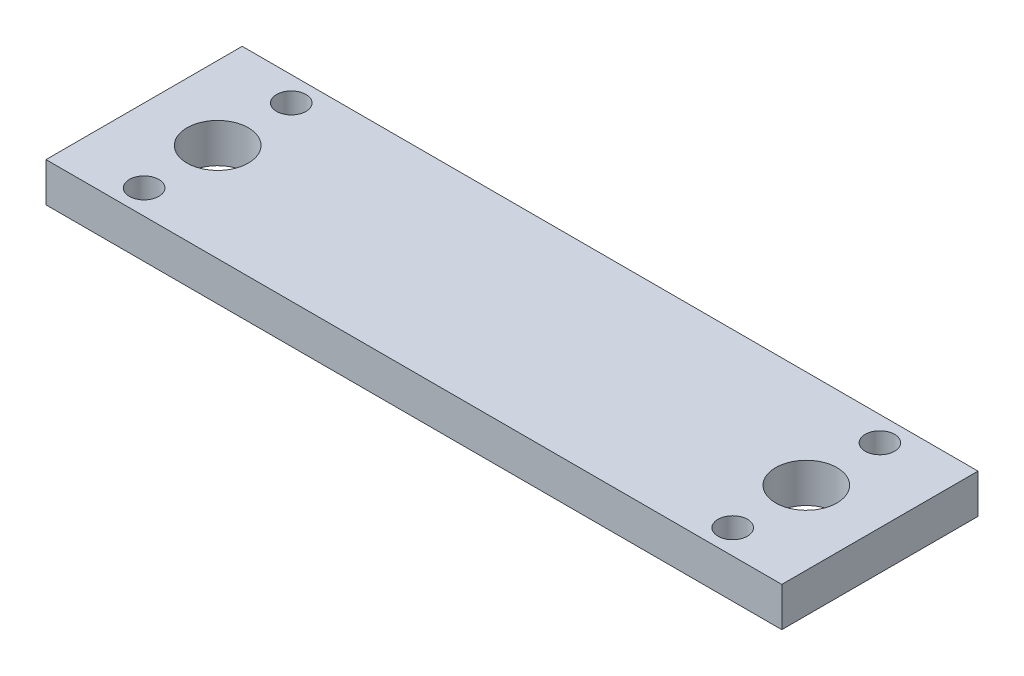
ISO-10303-21;
HEADER;
FILE_DESCRIPTION(('STEP AP214'),'2;1');
FILE_NAME('part.step','',(''),(''),'','','');
FILE_SCHEMA(('AUTOMOTIVE_DESIGN { 1 0 10303 214 1 1 1 1 }'));
ENDSEC;
DATA;
#1=APPLICATION_CONTEXT('core data for automotive mechanical design processes');
#2=APPLICATION_PROTOCOL_DEFINITION('international standard','automotive_design',2000,#1);
#3=PRODUCT_CONTEXT('',#1,'mechanical');
#4=PRODUCT('Part','Part','',(#3));
#5=PRODUCT_RELATED_PRODUCT_CATEGORY('part','',(#4));
#6=PRODUCT_DEFINITION_FORMATION('','',#4);
#7=PRODUCT_DEFINITION_CONTEXT('part definition',#1,'design');
#8=PRODUCT_DEFINITION('design','',#6,#7);
#9=PRODUCT_DEFINITION_SHAPE('','',#8);
#10=(LENGTH_UNIT() NAMED_UNIT(*) SI_UNIT(.MILLI.,.METRE.));
#11=(NAMED_UNIT(*) PLANE_ANGLE_UNIT() SI_UNIT($,.RADIAN.));
#12=(NAMED_UNIT(*) SI_UNIT($,.STERADIAN.) SOLID_ANGLE_UNIT());
#13=UNCERTAINTY_MEASURE_WITH_UNIT(LENGTH_MEASURE(1.E-05),#10,'distance_accuracy_value','');
#14=(GEOMETRIC_REPRESENTATION_CONTEXT(3) GLOBAL_UNCERTAINTY_ASSIGNED_CONTEXT((#13)) GLOBAL_UNIT_ASSIGNED_CONTEXT((#10,
#11,#12)) REPRESENTATION_CONTEXT('',''));
#15=CARTESIAN_POINT('',(0.,0.,0.));
#16=DIRECTION('',(0.,0.,1.));
#17=DIRECTION('',(1.,0.,0.));
#18=AXIS2_PLACEMENT_3D('',#15,#16,#17);
#19=CARTESIAN_POINT('',(0.,16.,0.));
#20=DIRECTION('',(0.,-1.,0.));
#21=DIRECTION('',(0.,0.,-1.));
#22=AXIS2_PLACEMENT_3D('',#19,#20,#21);
#23=PLANE('',#22);
#24=DIRECTION('',(0.,0.,-1.));
#25=VECTOR('',#24,1.);
#26=CARTESIAN_POINT('',(150.,16.,40.));
#27=LINE('',#26,#25);
#28=CARTESIAN_POINT('',(150.,16.,40.));
#29=VERTEX_POINT('',#28);
#30=CARTESIAN_POINT('',(150.,16.,-40.));
#31=VERTEX_POINT('',#30);
#32=EDGE_CURVE('E69',#29,#31,#27,.T.);
#33=ORIENTED_EDGE('',*,*,#32,.T.);
#34=DIRECTION('',(-1.,0.,0.));
#35=VECTOR('',#34,1.);
#36=CARTESIAN_POINT('',(-150.,16.,-40.));
#37=LINE('',#36,#35);
#38=CARTESIAN_POINT('',(-150.,16.,-40.));
#39=VERTEX_POINT('',#38);
#40=EDGE_CURVE('E64',#31,#39,#37,.T.);
#41=ORIENTED_EDGE('',*,*,#40,.T.);
#42=DIRECTION('',(0.,0.,1.));
#43=VECTOR('',#42,1.);
#44=CARTESIAN_POINT('',(-150.,16.,40.));
#45=LINE('',#44,#43);
#46=CARTESIAN_POINT('',(-150.,16.,40.));
#47=VERTEX_POINT('',#46);
#48=EDGE_CURVE('E67',#39,#47,#45,.T.);
#49=ORIENTED_EDGE('',*,*,#48,.T.);
#50=DIRECTION('',(1.,0.,0.));
#51=VECTOR('',#50,1.);
#52=CARTESIAN_POINT('',(-150.,16.,40.));
#53=LINE('',#52,#51);
#54=EDGE_CURVE('E34',#47,#29,#53,.T.);
#55=ORIENTED_EDGE('',*,*,#54,.T.);
#56=EDGE_LOOP('',(#33,#41,#49,#55));
#57=FACE_BOUND('',#56,.T.);
#58=CARTESIAN_POINT('',(120.,16.,0.));
#59=DIRECTION('',(0.,1.,0.));
#60=DIRECTION('',(0.,0.,1.));
#61=AXIS2_PLACEMENT_3D('',#58,#59,#60);
#62=CIRCLE('',#61,12.5);
#63=CARTESIAN_POINT('',(120.,16.,12.5));
#64=VERTEX_POINT('',#63);
#65=EDGE_CURVE('E97',#64,#64,#62,.T.);
#66=ORIENTED_EDGE('',*,*,#65,.F.);
#67=EDGE_LOOP('',(#66));
#68=FACE_BOUND('',#67,.T.);
#69=CARTESIAN_POINT('',(-120.,16.,0.));
#70=DIRECTION('',(0.,1.,0.));
#71=DIRECTION('',(0.,0.,1.));
#72=AXIS2_PLACEMENT_3D('',#69,#70,#71);
#73=CIRCLE('',#72,12.5);
#74=CARTESIAN_POINT('',(-120.,16.,12.5));
#75=VERTEX_POINT('',#74);
#76=EDGE_CURVE('E103',#75,#75,#73,.T.);
#77=ORIENTED_EDGE('',*,*,#76,.F.);
#78=EDGE_LOOP('',(#77));
#79=FACE_BOUND('',#78,.T.);
#80=CARTESIAN_POINT('',(120.,16.,-30.));
#81=DIRECTION('',(0.,1.,0.));
#82=DIRECTION('',(0.,0.,1.));
#83=AXIS2_PLACEMENT_3D('',#80,#81,#82);
#84=CIRCLE('',#83,6.);
#85=CARTESIAN_POINT('',(120.,16.,-24.));
#86=VERTEX_POINT('',#85);
#87=EDGE_CURVE('E109',#86,#86,#84,.T.);
#88=ORIENTED_EDGE('',*,*,#87,.F.);
#89=EDGE_LOOP('',(#88));
#90=FACE_BOUND('',#89,.T.);
#91=CARTESIAN_POINT('',(120.,16.,30.));
#92=DIRECTION('',(0.,1.,0.));
#93=DIRECTION('',(0.,0.,1.));
#94=AXIS2_PLACEMENT_3D('',#91,#92,#93);
#95=CIRCLE('',#94,6.);
#96=CARTESIAN_POINT('',(120.,16.,36.));
#97=VERTEX_POINT('',#96);
#98=EDGE_CURVE('E115',#97,#97,#95,.T.);
#99=ORIENTED_EDGE('',*,*,#98,.F.);
#100=EDGE_LOOP('',(#99));
#101=FACE_BOUND('',#100,.T.);
#102=CARTESIAN_POINT('',(-120.,16.,30.));
#103=DIRECTION('',(0.,1.,0.));
#104=DIRECTION('',(0.,0.,1.));
#105=AXIS2_PLACEMENT_3D('',#102,#103,#104);
#106=CIRCLE('',#105,6.);
#107=CARTESIAN_POINT('',(-120.,16.,36.));
#108=VERTEX_POINT('',#107);
#109=EDGE_CURVE('E121',#108,#108,#106,.T.);
#110=ORIENTED_EDGE('',*,*,#109,.F.);
#111=EDGE_LOOP('',(#110));
#112=FACE_BOUND('',#111,.T.);
#113=CARTESIAN_POINT('',(-120.,16.,-30.));
#114=DIRECTION('',(0.,1.,0.));
#115=DIRECTION('',(0.,0.,1.));
#116=AXIS2_PLACEMENT_3D('',#113,#114,#115);
#117=CIRCLE('',#116,6.);
#118=CARTESIAN_POINT('',(-120.,16.,-24.));
#119=VERTEX_POINT('',#118);
#120=EDGE_CURVE('E127',#119,#119,#117,.T.);
#121=ORIENTED_EDGE('',*,*,#120,.F.);
#122=EDGE_LOOP('',(#121));
#123=FACE_BOUND('',#122,.T.);
#124=ADVANCED_FACE('F17',(#57,#68,#79,#90,#101,#112,#123),#23,.F.);
#125=CARTESIAN_POINT('',(150.,16.,40.));
#126=DIRECTION('',(-1.,0.,0.));
#127=DIRECTION('',(0.,0.,1.));
#128=AXIS2_PLACEMENT_3D('',#125,#126,#127);
#129=PLANE('',#128);
#130=DIRECTION('',(0.,0.,-1.));
#131=VECTOR('',#130,1.);
#132=CARTESIAN_POINT('',(150.,0.,40.));
#133=LINE('',#132,#131);
#134=CARTESIAN_POINT('',(150.,0.,40.));
#135=VERTEX_POINT('',#134);
#136=CARTESIAN_POINT('',(150.,0.,-40.));
#137=VERTEX_POINT('',#136);
#138=EDGE_CURVE('E81',#135,#137,#133,.T.);
#139=ORIENTED_EDGE('',*,*,#138,.T.);
#140=DIRECTION('',(0.,-1.,0.));
#141=VECTOR('',#140,1.);
#142=CARTESIAN_POINT('',(150.,16.,-40.));
#143=LINE('',#142,#141);
#144=EDGE_CURVE('E11',#31,#137,#143,.T.);
#145=ORIENTED_EDGE('',*,*,#144,.F.);
#146=ORIENTED_EDGE('',*,*,#32,.F.);
#147=DIRECTION('',(0.,-1.,0.));
#148=VECTOR('',#147,1.);
#149=CARTESIAN_POINT('',(150.,16.,40.));
#150=LINE('',#149,#148);
#151=EDGE_CURVE('E77',#29,#135,#150,.T.);
#152=ORIENTED_EDGE('',*,*,#151,.T.);
#153=EDGE_LOOP('',(#139,#145,#146,#152));
#154=FACE_BOUND('',#153,.T.);
#155=ADVANCED_FACE('F19',(#154),#129,.F.);
#156=CARTESIAN_POINT('',(-150.,16.,-40.));
#157=DIRECTION('',(0.,0.,1.));
#158=DIRECTION('',(1.,0.,0.));
#159=AXIS2_PLACEMENT_3D('',#156,#157,#158);
#160=PLANE('',#159);
#161=DIRECTION('',(-1.,0.,0.));
#162=VECTOR('',#161,1.);
#163=CARTESIAN_POINT('',(-150.,0.,-40.));
#164=LINE('',#163,#162);
#165=CARTESIAN_POINT('',(-150.,0.,-40.));
#166=VERTEX_POINT('',#165);
#167=EDGE_CURVE('E73',#137,#166,#164,.T.);
#168=ORIENTED_EDGE('',*,*,#167,.T.);
#169=DIRECTION('',(0.,-1.,0.));
#170=VECTOR('',#169,1.);
#171=CARTESIAN_POINT('',(-150.,16.,-40.));
#172=LINE('',#171,#170);
#173=EDGE_CURVE('E26',#39,#166,#172,.T.);
#174=ORIENTED_EDGE('',*,*,#173,.F.);
#175=ORIENTED_EDGE('',*,*,#40,.F.);
#176=ORIENTED_EDGE('',*,*,#144,.T.);
#177=EDGE_LOOP('',(#168,#174,#175,#176));
#178=FACE_BOUND('',#177,.T.);
#179=ADVANCED_FACE('F72',(#178),#160,.F.);
#180=CARTESIAN_POINT('',(-150.,16.,40.));
#181=DIRECTION('',(1.,0.,0.));
#182=DIRECTION('',(0.,0.,-1.));
#183=AXIS2_PLACEMENT_3D('',#180,#181,#182);
#184=PLANE('',#183);
#185=DIRECTION('',(0.,0.,1.));
#186=VECTOR('',#185,1.);
#187=CARTESIAN_POINT('',(-150.,0.,40.));
#188=LINE('',#187,#186);
#189=CARTESIAN_POINT('',(-150.,0.,40.));
#190=VERTEX_POINT('',#189);
#191=EDGE_CURVE('E51',#166,#190,#188,.T.);
#192=ORIENTED_EDGE('',*,*,#191,.T.);
#193=DIRECTION('',(0.,-1.,0.));
#194=VECTOR('',#193,1.);
#195=CARTESIAN_POINT('',(-150.,16.,40.));
#196=LINE('',#195,#194);
#197=EDGE_CURVE('E74',#47,#190,#196,.T.);
#198=ORIENTED_EDGE('',*,*,#197,.F.);
#199=ORIENTED_EDGE('',*,*,#48,.F.);
#200=ORIENTED_EDGE('',*,*,#173,.T.);
#201=EDGE_LOOP('',(#192,#198,#199,#200));
#202=FACE_BOUND('',#201,.T.);
#203=ADVANCED_FACE('F75',(#202),#184,.F.);
#204=CARTESIAN_POINT('',(-150.,16.,40.));
#205=DIRECTION('',(0.,0.,-1.));
#206=DIRECTION('',(-1.,0.,0.));
#207=AXIS2_PLACEMENT_3D('',#204,#205,#206);
#208=PLANE('',#207);
#209=DIRECTION('',(1.,0.,0.));
#210=VECTOR('',#209,1.);
#211=CARTESIAN_POINT('',(-150.,0.,40.));
#212=LINE('',#211,#210);
#213=EDGE_CURVE('E57',#190,#135,#212,.T.);
#214=ORIENTED_EDGE('',*,*,#213,.T.);
#215=ORIENTED_EDGE('',*,*,#151,.F.);
#216=ORIENTED_EDGE('',*,*,#54,.F.);
#217=ORIENTED_EDGE('',*,*,#197,.T.);
#218=EDGE_LOOP('',(#214,#215,#216,#217));
#219=FACE_BOUND('',#218,.T.);
#220=ADVANCED_FACE('F89',(#219),#208,.F.);
#221=CARTESIAN_POINT('',(0.,0.,0.));
#222=DIRECTION('',(0.,-1.,0.));
#223=DIRECTION('',(0.,0.,-1.));
#224=AXIS2_PLACEMENT_3D('',#221,#222,#223);
#225=PLANE('',#224);
#226=CARTESIAN_POINT('',(-120.,0.,-30.));
#227=DIRECTION('',(0.,1.,0.));
#228=DIRECTION('',(0.,0.,1.));
#229=AXIS2_PLACEMENT_3D('',#226,#227,#228);
#230=CIRCLE('',#229,6.);
#231=CARTESIAN_POINT('',(-120.,0.,-24.));
#232=VERTEX_POINT('',#231);
#233=EDGE_CURVE('E124',#232,#232,#230,.T.);
#234=ORIENTED_EDGE('',*,*,#233,.T.);
#235=EDGE_LOOP('',(#234));
#236=FACE_BOUND('',#235,.T.);
#237=CARTESIAN_POINT('',(-120.,0.,30.));
#238=DIRECTION('',(0.,1.,0.));
#239=DIRECTION('',(0.,0.,1.));
#240=AXIS2_PLACEMENT_3D('',#237,#238,#239);
#241=CIRCLE('',#240,6.);
#242=CARTESIAN_POINT('',(-120.,0.,36.));
#243=VERTEX_POINT('',#242);
#244=EDGE_CURVE('E118',#243,#243,#241,.T.);
#245=ORIENTED_EDGE('',*,*,#244,.T.);
#246=EDGE_LOOP('',(#245));
#247=FACE_BOUND('',#246,.T.);
#248=CARTESIAN_POINT('',(120.,0.,30.));
#249=DIRECTION('',(0.,1.,0.));
#250=DIRECTION('',(0.,0.,1.));
#251=AXIS2_PLACEMENT_3D('',#248,#249,#250);
#252=CIRCLE('',#251,6.);
#253=CARTESIAN_POINT('',(120.,0.,36.));
#254=VERTEX_POINT('',#253);
#255=EDGE_CURVE('E112',#254,#254,#252,.T.);
#256=ORIENTED_EDGE('',*,*,#255,.T.);
#257=EDGE_LOOP('',(#256));
#258=FACE_BOUND('',#257,.T.);
#259=CARTESIAN_POINT('',(120.,0.,-30.));
#260=DIRECTION('',(0.,1.,0.));
#261=DIRECTION('',(0.,0.,1.));
#262=AXIS2_PLACEMENT_3D('',#259,#260,#261);
#263=CIRCLE('',#262,6.);
#264=CARTESIAN_POINT('',(120.,0.,-24.));
#265=VERTEX_POINT('',#264);
#266=EDGE_CURVE('E106',#265,#265,#263,.T.);
#267=ORIENTED_EDGE('',*,*,#266,.T.);
#268=EDGE_LOOP('',(#267));
#269=FACE_BOUND('',#268,.T.);
#270=CARTESIAN_POINT('',(-120.,0.,0.));
#271=DIRECTION('',(0.,1.,0.));
#272=DIRECTION('',(0.,0.,1.));
#273=AXIS2_PLACEMENT_3D('',#270,#271,#272);
#274=CIRCLE('',#273,12.5);
#275=CARTESIAN_POINT('',(-120.,0.,12.5));
#276=VERTEX_POINT('',#275);
#277=EDGE_CURVE('E100',#276,#276,#274,.T.);
#278=ORIENTED_EDGE('',*,*,#277,.T.);
#279=EDGE_LOOP('',(#278));
#280=FACE_BOUND('',#279,.T.);
#281=CARTESIAN_POINT('',(120.,0.,0.));
#282=DIRECTION('',(0.,1.,0.));
#283=DIRECTION('',(0.,0.,1.));
#284=AXIS2_PLACEMENT_3D('',#281,#282,#283);
#285=CIRCLE('',#284,12.5);
#286=CARTESIAN_POINT('',(120.,0.,12.5));
#287=VERTEX_POINT('',#286);
#288=EDGE_CURVE('E84',#287,#287,#285,.T.);
#289=ORIENTED_EDGE('',*,*,#288,.T.);
#290=EDGE_LOOP('',(#289));
#291=FACE_BOUND('',#290,.T.);
#292=ORIENTED_EDGE('',*,*,#138,.F.);
#293=ORIENTED_EDGE('',*,*,#213,.F.);
#294=ORIENTED_EDGE('',*,*,#191,.F.);
#295=ORIENTED_EDGE('',*,*,#167,.F.);
#296=EDGE_LOOP('',(#292,#293,#294,#295));
#297=FACE_BOUND('',#296,.T.);
#298=ADVANCED_FACE('F92',(#236,#247,#258,#269,#280,#291,#297),#225,.T.);
#299=CARTESIAN_POINT('',(120.,16.,0.));
#300=DIRECTION('',(0.,1.,0.));
#301=DIRECTION('',(0.,0.,1.));
#302=AXIS2_PLACEMENT_3D('',#299,#300,#301);
#303=CYLINDRICAL_SURFACE('',#302,12.5);
#304=ORIENTED_EDGE('',*,*,#288,.F.);
#305=EDGE_LOOP('',(#304));
#306=FACE_BOUND('',#305,.T.);
#307=ORIENTED_EDGE('',*,*,#65,.T.);
#308=EDGE_LOOP('',(#307));
#309=FACE_BOUND('',#308,.T.);
#310=ADVANCED_FACE('F142',(#306,#309),#303,.F.);
#311=CARTESIAN_POINT('',(-120.,16.,0.));
#312=DIRECTION('',(0.,1.,0.));
#313=DIRECTION('',(0.,0.,1.));
#314=AXIS2_PLACEMENT_3D('',#311,#312,#313);
#315=CYLINDRICAL_SURFACE('',#314,12.5);
#316=ORIENTED_EDGE('',*,*,#277,.F.);
#317=EDGE_LOOP('',(#316));
#318=FACE_BOUND('',#317,.T.);
#319=ORIENTED_EDGE('',*,*,#76,.T.);
#320=EDGE_LOOP('',(#319));
#321=FACE_BOUND('',#320,.T.);
#322=ADVANCED_FACE('F182',(#318,#321),#315,.F.);
#323=CARTESIAN_POINT('',(120.,16.,-30.));
#324=DIRECTION('',(0.,1.,0.));
#325=DIRECTION('',(0.,0.,1.));
#326=AXIS2_PLACEMENT_3D('',#323,#324,#325);
#327=CYLINDRICAL_SURFACE('',#326,6.);
#328=ORIENTED_EDGE('',*,*,#266,.F.);
#329=EDGE_LOOP('',(#328));
#330=FACE_BOUND('',#329,.T.);
#331=ORIENTED_EDGE('',*,*,#87,.T.);
#332=EDGE_LOOP('',(#331));
#333=FACE_BOUND('',#332,.T.);
#334=ADVANCED_FACE('F190',(#330,#333),#327,.F.);
#335=CARTESIAN_POINT('',(120.,16.,30.));
#336=DIRECTION('',(0.,1.,0.));
#337=DIRECTION('',(0.,0.,1.));
#338=AXIS2_PLACEMENT_3D('',#335,#336,#337);
#339=CYLINDRICAL_SURFACE('',#338,6.);
#340=ORIENTED_EDGE('',*,*,#255,.F.);
#341=EDGE_LOOP('',(#340));
#342=FACE_BOUND('',#341,.T.);
#343=ORIENTED_EDGE('',*,*,#98,.T.);
#344=EDGE_LOOP('',(#343));
#345=FACE_BOUND('',#344,.T.);
#346=ADVANCED_FACE('F198',(#342,#345),#339,.F.);
#347=CARTESIAN_POINT('',(-120.,16.,30.));
#348=DIRECTION('',(0.,1.,0.));
#349=DIRECTION('',(0.,0.,1.));
#350=AXIS2_PLACEMENT_3D('',#347,#348,#349);
#351=CYLINDRICAL_SURFACE('',#350,6.);
#352=ORIENTED_EDGE('',*,*,#244,.F.);
#353=EDGE_LOOP('',(#352));
#354=FACE_BOUND('',#353,.T.);
#355=ORIENTED_EDGE('',*,*,#109,.T.);
#356=EDGE_LOOP('',(#355));
#357=FACE_BOUND('',#356,.T.);
#358=ADVANCED_FACE('F207',(#354,#357),#351,.F.);
#359=CARTESIAN_POINT('',(-120.,16.,-30.));
#360=DIRECTION('',(0.,1.,0.));
#361=DIRECTION('',(0.,0.,1.));
#362=AXIS2_PLACEMENT_3D('',#359,#360,#361);
#363=CYLINDRICAL_SURFACE('',#362,6.);
#364=ORIENTED_EDGE('',*,*,#233,.F.);
#365=EDGE_LOOP('',(#364));
#366=FACE_BOUND('',#365,.T.);
#367=ORIENTED_EDGE('',*,*,#120,.T.);
#368=EDGE_LOOP('',(#367));
#369=FACE_BOUND('',#368,.T.);
#370=ADVANCED_FACE('F131',(#366,#369),#363,.F.);
#371=CLOSED_SHELL('',(#124,#155,#179,#203,#220,#298,#310,#322,#334,#346,#358,#370));
#372=MANIFOLD_SOLID_BREP('B1',#371);
#373=ADVANCED_BREP_SHAPE_REPRESENTATION('',(#18,#372),#14);
#374=SHAPE_DEFINITION_REPRESENTATION(#9,#373);
ENDSEC;
END-ISO-10303-21;
